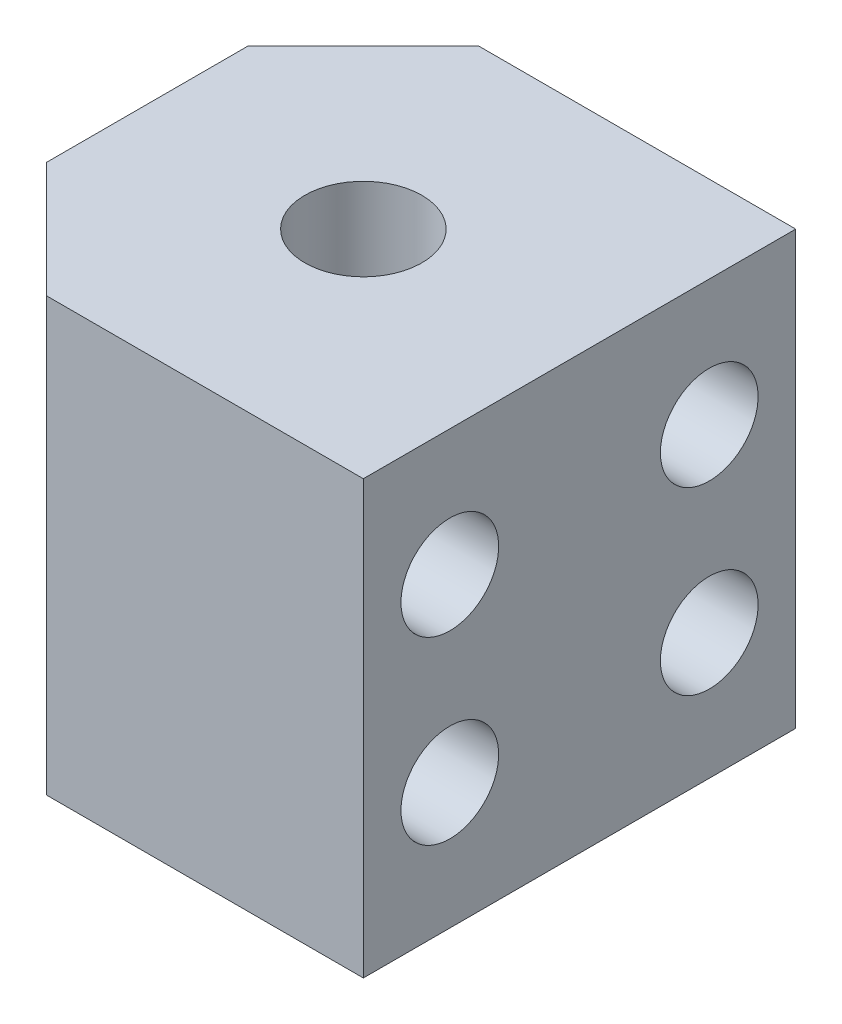
ISO-10303-21;
HEADER;
FILE_DESCRIPTION(('STEP AP214'),'2;1');
FILE_NAME('part.step','',(''),(''),'','','');
FILE_SCHEMA(('AUTOMOTIVE_DESIGN { 1 0 10303 214 1 1 1 1 }'));
ENDSEC;
DATA;
#1=APPLICATION_CONTEXT('core data for automotive mechanical design processes');
#2=APPLICATION_PROTOCOL_DEFINITION('international standard','automotive_design',2000,#1);
#3=PRODUCT_CONTEXT('',#1,'mechanical');
#4=PRODUCT('Part','Part','',(#3));
#5=PRODUCT_RELATED_PRODUCT_CATEGORY('part','',(#4));
#6=PRODUCT_DEFINITION_FORMATION('','',#4);
#7=PRODUCT_DEFINITION_CONTEXT('part definition',#1,'design');
#8=PRODUCT_DEFINITION('design','',#6,#7);
#9=PRODUCT_DEFINITION_SHAPE('','',#8);
#10=(LENGTH_UNIT() NAMED_UNIT(*) SI_UNIT(.MILLI.,.METRE.));
#11=(NAMED_UNIT(*) PLANE_ANGLE_UNIT() SI_UNIT($,.RADIAN.));
#12=(NAMED_UNIT(*) SI_UNIT($,.STERADIAN.) SOLID_ANGLE_UNIT());
#13=UNCERTAINTY_MEASURE_WITH_UNIT(LENGTH_MEASURE(1.E-05),#10,'distance_accuracy_value','');
#14=(GEOMETRIC_REPRESENTATION_CONTEXT(3) GLOBAL_UNCERTAINTY_ASSIGNED_CONTEXT((#13)) GLOBAL_UNIT_ASSIGNED_CONTEXT((#10,
#11,#12)) REPRESENTATION_CONTEXT('',''));
#15=CARTESIAN_POINT('',(0.,0.,0.));
#16=DIRECTION('',(0.,0.,1.));
#17=DIRECTION('',(1.,0.,0.));
#18=AXIS2_PLACEMENT_3D('',#15,#16,#17);
#19=CARTESIAN_POINT('',(-9.525,19.05,-9.525));
#20=DIRECTION('',(1.,0.,0.));
#21=DIRECTION('',(0.,0.,-1.));
#22=AXIS2_PLACEMENT_3D('',#19,#20,#21);
#23=PLANE('',#22);
#24=DIRECTION('',(0.,0.,1.));
#25=VECTOR('',#24,1.);
#26=CARTESIAN_POINT('',(-9.525,19.05,-9.525));
#27=LINE('',#26,#25);
#28=CARTESIAN_POINT('',(-9.525,19.05,-4.445));
#29=VERTEX_POINT('',#28);
#30=CARTESIAN_POINT('',(-9.525,19.05,4.44499999999998));
#31=VERTEX_POINT('',#30);
#32=EDGE_CURVE('E124',#29,#31,#27,.T.);
#33=ORIENTED_EDGE('',*,*,#32,.F.);
#34=DIRECTION('',(0.,-1.,0.));
#35=VECTOR('',#34,1.);
#36=CARTESIAN_POINT('',(-9.525,19.05,-4.445));
#37=LINE('',#36,#35);
#38=CARTESIAN_POINT('',(-9.525,16.8016307248751,-4.445));
#39=VERTEX_POINT('',#38);
#40=EDGE_CURVE('E162',#29,#39,#37,.T.);
#41=ORIENTED_EDGE('',*,*,#40,.T.);
#42=CARTESIAN_POINT('',(-9.525,13.49375,-5.715));
#43=DIRECTION('',(-1.,0.,0.));
#44=DIRECTION('',(0.,0.,1.));
#45=AXIS2_PLACEMENT_3D('',#42,#43,#44);
#46=CIRCLE('',#45,3.5433);
#47=CARTESIAN_POINT('',(-9.525,10.1858692751249,-4.445));
#48=VERTEX_POINT('',#47);
#49=EDGE_CURVE('E214',#48,#39,#46,.T.);
#50=ORIENTED_EDGE('',*,*,#49,.F.);
#51=DIRECTION('',(0.,-1.,0.));
#52=VECTOR('',#51,1.);
#53=CARTESIAN_POINT('',(-9.525,19.05,-4.445));
#54=LINE('',#53,#52);
#55=CARTESIAN_POINT('',(-9.525,8.86413072487507,-4.445));
#56=VERTEX_POINT('',#55);
#57=EDGE_CURVE('E160',#48,#56,#54,.T.);
#58=ORIENTED_EDGE('',*,*,#57,.T.);
#59=CARTESIAN_POINT('',(-9.525,5.55625,-5.715));
#60=DIRECTION('',(-1.,0.,0.));
#61=DIRECTION('',(0.,0.,1.));
#62=AXIS2_PLACEMENT_3D('',#59,#60,#61);
#63=CIRCLE('',#62,3.5433);
#64=CARTESIAN_POINT('',(-9.525,2.24836927512493,-4.445));
#65=VERTEX_POINT('',#64);
#66=EDGE_CURVE('E226',#65,#56,#63,.T.);
#67=ORIENTED_EDGE('',*,*,#66,.F.);
#68=DIRECTION('',(0.,-1.,0.));
#69=VECTOR('',#68,1.);
#70=CARTESIAN_POINT('',(-9.525,19.05,-4.445));
#71=LINE('',#70,#69);
#72=CARTESIAN_POINT('',(-9.525,0.,-4.445));
#73=VERTEX_POINT('',#72);
#74=EDGE_CURVE('E158',#65,#73,#71,.T.);
#75=ORIENTED_EDGE('',*,*,#74,.T.);
#76=DIRECTION('',(0.,0.,1.));
#77=VECTOR('',#76,1.);
#78=CARTESIAN_POINT('',(-9.525,0.,-9.525));
#79=LINE('',#78,#77);
#80=CARTESIAN_POINT('',(-9.525,0.,4.44499999999998));
#81=VERTEX_POINT('',#80);
#82=EDGE_CURVE('E143',#73,#81,#79,.T.);
#83=ORIENTED_EDGE('',*,*,#82,.T.);
#84=DIRECTION('',(0.,1.,0.));
#85=VECTOR('',#84,1.);
#86=CARTESIAN_POINT('',(-9.525,19.05,4.44499999999999));
#87=LINE('',#86,#85);
#88=CARTESIAN_POINT('',(-9.525,2.24836927512494,4.44499999999999));
#89=VERTEX_POINT('',#88);
#90=EDGE_CURVE('E156',#81,#89,#87,.T.);
#91=ORIENTED_EDGE('',*,*,#90,.T.);
#92=CARTESIAN_POINT('',(-9.525,5.55625,5.715));
#93=DIRECTION('',(-1.,0.,0.));
#94=DIRECTION('',(0.,0.,1.));
#95=AXIS2_PLACEMENT_3D('',#92,#93,#94);
#96=CIRCLE('',#95,3.5433);
#97=CARTESIAN_POINT('',(-9.525,8.86413072487506,4.44499999999999));
#98=VERTEX_POINT('',#97);
#99=EDGE_CURVE('E183',#98,#89,#96,.T.);
#100=ORIENTED_EDGE('',*,*,#99,.F.);
#101=DIRECTION('',(0.,1.,0.));
#102=VECTOR('',#101,1.);
#103=CARTESIAN_POINT('',(-9.525,19.05,4.44499999999999));
#104=LINE('',#103,#102);
#105=CARTESIAN_POINT('',(-9.525,10.1858692751249,4.44499999999999));
#106=VERTEX_POINT('',#105);
#107=EDGE_CURVE('E154',#98,#106,#104,.T.);
#108=ORIENTED_EDGE('',*,*,#107,.T.);
#109=CARTESIAN_POINT('',(-9.525,13.49375,5.715));
#110=DIRECTION('',(-1.,0.,0.));
#111=DIRECTION('',(0.,0.,1.));
#112=AXIS2_PLACEMENT_3D('',#109,#110,#111);
#113=CIRCLE('',#112,3.5433);
#114=CARTESIAN_POINT('',(-9.525,16.8016307248751,4.44499999999999));
#115=VERTEX_POINT('',#114);
#116=EDGE_CURVE('E197',#115,#106,#113,.T.);
#117=ORIENTED_EDGE('',*,*,#116,.F.);
#118=DIRECTION('',(0.,1.,0.));
#119=VECTOR('',#118,1.);
#120=CARTESIAN_POINT('',(-9.525,19.05,4.44499999999999));
#121=LINE('',#120,#119);
#122=EDGE_CURVE('E133',#115,#31,#121,.T.);
#123=ORIENTED_EDGE('',*,*,#122,.T.);
#124=EDGE_LOOP('',(#33,#41,#50,#58,#67,#75,#83,#91,#100,#108,#117,#123));
#125=FACE_BOUND('',#124,.T.);
#126=ADVANCED_FACE('F39',(#125),#23,.F.);
#127=CARTESIAN_POINT('',(-9.525,19.05,9.525));
#128=DIRECTION('',(0.,0.,-1.));
#129=DIRECTION('',(-1.,0.,0.));
#130=AXIS2_PLACEMENT_3D('',#127,#128,#129);
#131=PLANE('',#130);
#132=DIRECTION('',(1.,0.,0.));
#133=VECTOR('',#132,1.);
#134=CARTESIAN_POINT('',(-9.525,19.05,9.525));
#135=LINE('',#134,#133);
#136=CARTESIAN_POINT('',(-4.445,19.05,9.525));
#137=VERTEX_POINT('',#136);
#138=CARTESIAN_POINT('',(9.525,19.05,9.525));
#139=VERTEX_POINT('',#138);
#140=EDGE_CURVE('E115',#137,#139,#135,.T.);
#141=ORIENTED_EDGE('',*,*,#140,.F.);
#142=DIRECTION('',(0.,-1.,0.));
#143=VECTOR('',#142,1.);
#144=CARTESIAN_POINT('',(-4.445,19.05,9.525));
#145=LINE('',#144,#143);
#146=CARTESIAN_POINT('',(-4.445,0.,9.525));
#147=VERTEX_POINT('',#146);
#148=EDGE_CURVE('E177',#137,#147,#145,.T.);
#149=ORIENTED_EDGE('',*,*,#148,.T.);
#150=DIRECTION('',(1.,0.,0.));
#151=VECTOR('',#150,1.);
#152=CARTESIAN_POINT('',(-9.525,0.,9.525));
#153=LINE('',#152,#151);
#154=CARTESIAN_POINT('',(9.525,0.,9.525));
#155=VERTEX_POINT('',#154);
#156=EDGE_CURVE('E130',#147,#155,#153,.T.);
#157=ORIENTED_EDGE('',*,*,#156,.T.);
#158=DIRECTION('',(0.,-1.,0.));
#159=VECTOR('',#158,1.);
#160=CARTESIAN_POINT('',(9.525,19.05,9.525));
#161=LINE('',#160,#159);
#162=EDGE_CURVE('E127',#139,#155,#161,.T.);
#163=ORIENTED_EDGE('',*,*,#162,.F.);
#164=EDGE_LOOP('',(#141,#149,#157,#163));
#165=FACE_BOUND('',#164,.T.);
#166=ADVANCED_FACE('F128',(#165),#131,.F.);
#167=CARTESIAN_POINT('',(9.525,19.05,-9.525));
#168=DIRECTION('',(-1.,0.,0.));
#169=DIRECTION('',(0.,0.,1.));
#170=AXIS2_PLACEMENT_3D('',#167,#168,#169);
#171=PLANE('',#170);
#172=CARTESIAN_POINT('',(9.525,5.55625,5.715));
#173=DIRECTION('',(-1.,0.,0.));
#174=DIRECTION('',(0.,0.,1.));
#175=AXIS2_PLACEMENT_3D('',#172,#173,#174);
#176=CIRCLE('',#175,2.15265);
#177=CARTESIAN_POINT('',(9.525,5.55625,7.86764999999999));
#178=VERTEX_POINT('',#177);
#179=EDGE_CURVE('E199',#178,#178,#176,.T.);
#180=ORIENTED_EDGE('',*,*,#179,.T.);
#181=EDGE_LOOP('',(#180));
#182=FACE_BOUND('',#181,.T.);
#183=CARTESIAN_POINT('',(9.525,13.49375,5.715));
#184=DIRECTION('',(-1.,0.,0.));
#185=DIRECTION('',(0.,0.,1.));
#186=AXIS2_PLACEMENT_3D('',#183,#184,#185);
#187=CIRCLE('',#186,2.15265);
#188=CARTESIAN_POINT('',(9.525,13.49375,7.86765));
#189=VERTEX_POINT('',#188);
#190=EDGE_CURVE('E211',#189,#189,#187,.T.);
#191=ORIENTED_EDGE('',*,*,#190,.T.);
#192=EDGE_LOOP('',(#191));
#193=FACE_BOUND('',#192,.T.);
#194=CARTESIAN_POINT('',(9.525,13.49375,-5.715));
#195=DIRECTION('',(-1.,0.,0.));
#196=DIRECTION('',(0.,0.,1.));
#197=AXIS2_PLACEMENT_3D('',#194,#195,#196);
#198=CIRCLE('',#197,2.15265);
#199=CARTESIAN_POINT('',(9.525,13.49375,-3.56235));
#200=VERTEX_POINT('',#199);
#201=EDGE_CURVE('E223',#200,#200,#198,.T.);
#202=ORIENTED_EDGE('',*,*,#201,.T.);
#203=EDGE_LOOP('',(#202));
#204=FACE_BOUND('',#203,.T.);
#205=CARTESIAN_POINT('',(9.525,5.55625,-5.715));
#206=DIRECTION('',(-1.,0.,0.));
#207=DIRECTION('',(0.,0.,1.));
#208=AXIS2_PLACEMENT_3D('',#205,#206,#207);
#209=CIRCLE('',#208,2.15265);
#210=CARTESIAN_POINT('',(9.525,5.55625,-3.56235));
#211=VERTEX_POINT('',#210);
#212=EDGE_CURVE('E235',#211,#211,#209,.T.);
#213=ORIENTED_EDGE('',*,*,#212,.T.);
#214=EDGE_LOOP('',(#213));
#215=FACE_BOUND('',#214,.T.);
#216=DIRECTION('',(0.,0.,-1.));
#217=VECTOR('',#216,1.);
#218=CARTESIAN_POINT('',(9.525,0.,-9.525));
#219=LINE('',#218,#217);
#220=CARTESIAN_POINT('',(9.525,0.,-9.525));
#221=VERTEX_POINT('',#220);
#222=EDGE_CURVE('E148',#155,#221,#219,.T.);
#223=ORIENTED_EDGE('',*,*,#222,.T.);
#224=DIRECTION('',(0.,-1.,0.));
#225=VECTOR('',#224,1.);
#226=CARTESIAN_POINT('',(9.525,19.05,-9.525));
#227=LINE('',#226,#225);
#228=CARTESIAN_POINT('',(9.525,19.05,-9.525));
#229=VERTEX_POINT('',#228);
#230=EDGE_CURVE('E134',#229,#221,#227,.T.);
#231=ORIENTED_EDGE('',*,*,#230,.F.);
#232=DIRECTION('',(0.,0.,-1.));
#233=VECTOR('',#232,1.);
#234=CARTESIAN_POINT('',(9.525,19.05,-9.525));
#235=LINE('',#234,#233);
#236=EDGE_CURVE('E119',#139,#229,#235,.T.);
#237=ORIENTED_EDGE('',*,*,#236,.F.);
#238=ORIENTED_EDGE('',*,*,#162,.T.);
#239=EDGE_LOOP('',(#223,#231,#237,#238));
#240=FACE_BOUND('',#239,.T.);
#241=ADVANCED_FACE('F136',(#182,#193,#204,#215,#240),#171,.F.);
#242=CARTESIAN_POINT('',(-9.525,19.05,-9.525));
#243=DIRECTION('',(0.,0.,1.));
#244=DIRECTION('',(1.,0.,0.));
#245=AXIS2_PLACEMENT_3D('',#242,#243,#244);
#246=PLANE('',#245);
#247=DIRECTION('',(-1.,0.,0.));
#248=VECTOR('',#247,1.);
#249=CARTESIAN_POINT('',(-9.525,0.,-9.525));
#250=LINE('',#249,#248);
#251=CARTESIAN_POINT('',(-4.44499999999999,0.,-9.525));
#252=VERTEX_POINT('',#251);
#253=EDGE_CURVE('E150',#221,#252,#250,.T.);
#254=ORIENTED_EDGE('',*,*,#253,.T.);
#255=DIRECTION('',(0.,1.,0.));
#256=VECTOR('',#255,1.);
#257=CARTESIAN_POINT('',(-4.44499999999999,19.05,-9.525));
#258=LINE('',#257,#256);
#259=CARTESIAN_POINT('',(-4.44499999999999,19.05,-9.525));
#260=VERTEX_POINT('',#259);
#261=EDGE_CURVE('E62',#252,#260,#258,.T.);
#262=ORIENTED_EDGE('',*,*,#261,.T.);
#263=DIRECTION('',(-1.,0.,0.));
#264=VECTOR('',#263,1.);
#265=CARTESIAN_POINT('',(-9.525,19.05,-9.525));
#266=LINE('',#265,#264);
#267=EDGE_CURVE('E138',#229,#260,#266,.T.);
#268=ORIENTED_EDGE('',*,*,#267,.F.);
#269=ORIENTED_EDGE('',*,*,#230,.T.);
#270=EDGE_LOOP('',(#254,#262,#268,#269));
#271=FACE_BOUND('',#270,.T.);
#272=ADVANCED_FACE('F248',(#271),#246,.F.);
#273=CARTESIAN_POINT('',(0.,19.05,0.));
#274=DIRECTION('',(0.,1.,0.));
#275=DIRECTION('',(0.,0.,1.));
#276=AXIS2_PLACEMENT_3D('',#273,#274,#275);
#277=PLANE('',#276);
#278=CARTESIAN_POINT('',(0.,19.05,0.));
#279=DIRECTION('',(0.,-1.,0.));
#280=DIRECTION('',(0.,0.,-1.));
#281=AXIS2_PLACEMENT_3D('',#278,#279,#280);
#282=CIRCLE('',#281,2.57937);
#283=CARTESIAN_POINT('',(0.,19.05,-2.57937));
#284=VERTEX_POINT('',#283);
#285=EDGE_CURVE('E146',#284,#284,#282,.T.);
#286=ORIENTED_EDGE('',*,*,#285,.T.);
#287=EDGE_LOOP('',(#286));
#288=FACE_BOUND('',#287,.T.);
#289=ORIENTED_EDGE('',*,*,#267,.T.);
#290=DIRECTION('',(0.707106781186549,0.,-0.707106781186547));
#291=VECTOR('',#290,1.);
#292=CARTESIAN_POINT('',(-6.98499999999999,19.05,-6.98500000000001));
#293=LINE('',#292,#291);
#294=EDGE_CURVE('E175',#260,#29,#293,.F.);
#295=ORIENTED_EDGE('',*,*,#294,.T.);
#296=ORIENTED_EDGE('',*,*,#32,.T.);
#297=DIRECTION('',(-0.707106781186547,0.,-0.707106781186548));
#298=VECTOR('',#297,1.);
#299=CARTESIAN_POINT('',(-6.985,19.05,6.98499999999999));
#300=LINE('',#299,#298);
#301=EDGE_CURVE('E54',#31,#137,#300,.F.);
#302=ORIENTED_EDGE('',*,*,#301,.T.);
#303=ORIENTED_EDGE('',*,*,#140,.T.);
#304=ORIENTED_EDGE('',*,*,#236,.T.);
#305=EDGE_LOOP('',(#289,#295,#296,#302,#303,#304));
#306=FACE_BOUND('',#305,.T.);
#307=ADVANCED_FACE('F117',(#288,#306),#277,.T.);
#308=CARTESIAN_POINT('',(0.,0.,0.));
#309=DIRECTION('',(0.,1.,0.));
#310=DIRECTION('',(0.,0.,1.));
#311=AXIS2_PLACEMENT_3D('',#308,#309,#310);
#312=PLANE('',#311);
#313=CARTESIAN_POINT('',(0.,0.,0.));
#314=DIRECTION('',(0.,-1.,0.));
#315=DIRECTION('',(0.,0.,-1.));
#316=AXIS2_PLACEMENT_3D('',#313,#314,#315);
#317=CIRCLE('',#316,2.57936999999999);
#318=CARTESIAN_POINT('',(0.,0.,-2.57936999999999));
#319=VERTEX_POINT('',#318);
#320=EDGE_CURVE('E238',#319,#319,#317,.T.);
#321=ORIENTED_EDGE('',*,*,#320,.F.);
#322=EDGE_LOOP('',(#321));
#323=FACE_BOUND('',#322,.T.);
#324=ORIENTED_EDGE('',*,*,#82,.F.);
#325=DIRECTION('',(-0.707106781186549,0.,0.707106781186547));
#326=VECTOR('',#325,1.);
#327=CARTESIAN_POINT('',(-9.525,0.,-4.445));
#328=LINE('',#327,#326);
#329=EDGE_CURVE('E171',#73,#252,#328,.F.);
#330=ORIENTED_EDGE('',*,*,#329,.T.);
#331=ORIENTED_EDGE('',*,*,#253,.F.);
#332=ORIENTED_EDGE('',*,*,#222,.F.);
#333=ORIENTED_EDGE('',*,*,#156,.F.);
#334=DIRECTION('',(0.707106781186547,0.,0.707106781186548));
#335=VECTOR('',#334,1.);
#336=CARTESIAN_POINT('',(-4.445,0.,9.525));
#337=LINE('',#336,#335);
#338=EDGE_CURVE('E169',#147,#81,#337,.F.);
#339=ORIENTED_EDGE('',*,*,#338,.T.);
#340=EDGE_LOOP('',(#324,#330,#331,#332,#333,#339));
#341=FACE_BOUND('',#340,.T.);
#342=ADVANCED_FACE('F246',(#323,#341),#312,.F.);
#343=CARTESIAN_POINT('',(0.,0.,0.));
#344=DIRECTION('',(0.,-1.,0.));
#345=DIRECTION('',(0.,0.,-1.));
#346=AXIS2_PLACEMENT_3D('',#343,#344,#345);
#347=CYLINDRICAL_SURFACE('',#346,2.57936999999999);
#348=ORIENTED_EDGE('',*,*,#285,.F.);
#349=EDGE_LOOP('',(#348));
#350=FACE_BOUND('',#349,.T.);
#351=ORIENTED_EDGE('',*,*,#320,.T.);
#352=EDGE_LOOP('',(#351));
#353=FACE_BOUND('',#352,.T.);
#354=ADVANCED_FACE('F362',(#350,#353),#347,.F.);
#355=CARTESIAN_POINT('',(-9.525,5.55625,-5.715));
#356=DIRECTION('',(-1.,0.,0.));
#357=DIRECTION('',(0.,0.,1.));
#358=AXIS2_PLACEMENT_3D('',#355,#356,#357);
#359=CYLINDRICAL_SURFACE('',#358,2.15265);
#360=ORIENTED_EDGE('',*,*,#212,.F.);
#361=EDGE_LOOP('',(#360));
#362=FACE_BOUND('',#361,.T.);
#363=CARTESIAN_POINT('',(-2.8452401744981,5.55625,-5.715));
#364=DIRECTION('',(-1.,0.,0.));
#365=DIRECTION('',(0.,0.,1.));
#366=AXIS2_PLACEMENT_3D('',#363,#364,#365);
#367=CIRCLE('',#366,2.15265);
#368=CARTESIAN_POINT('',(-2.8452401744981,5.55625,-3.56235));
#369=VERTEX_POINT('',#368);
#370=EDGE_CURVE('E232',#369,#369,#367,.T.);
#371=ORIENTED_EDGE('',*,*,#370,.T.);
#372=EDGE_LOOP('',(#371));
#373=FACE_BOUND('',#372,.T.);
#374=ADVANCED_FACE('F414',(#362,#373),#359,.F.);
#375=CARTESIAN_POINT('',(-4.445,5.55625,-5.715));
#376=DIRECTION('',(-1.,0.,0.));
#377=DIRECTION('',(0.,0.,1.));
#378=AXIS2_PLACEMENT_3D('',#375,#376,#377);
#379=CONICAL_SURFACE('',#378,3.5433,0.715584993317675);
#380=ORIENTED_EDGE('',*,*,#370,.F.);
#381=EDGE_LOOP('',(#380));
#382=FACE_BOUND('',#381,.T.);
#383=CARTESIAN_POINT('',(-4.445,5.55625,-5.715));
#384=DIRECTION('',(-1.,0.,0.));
#385=DIRECTION('',(0.,0.,1.));
#386=AXIS2_PLACEMENT_3D('',#383,#384,#385);
#387=CIRCLE('',#386,3.5433);
#388=CARTESIAN_POINT('',(-4.445,5.55625,-2.1717));
#389=VERTEX_POINT('',#388);
#390=EDGE_CURVE('E229',#389,#389,#387,.T.);
#391=ORIENTED_EDGE('',*,*,#390,.T.);
#392=EDGE_LOOP('',(#391));
#393=FACE_BOUND('',#392,.T.);
#394=ADVANCED_FACE('F374',(#382,#393),#379,.F.);
#395=CARTESIAN_POINT('',(-9.525,5.55625,-5.715));
#396=DIRECTION('',(-1.,0.,0.));
#397=DIRECTION('',(0.,0.,1.));
#398=AXIS2_PLACEMENT_3D('',#395,#396,#397);
#399=CYLINDRICAL_SURFACE('',#398,3.5433);
#400=ORIENTED_EDGE('',*,*,#390,.F.);
#401=EDGE_LOOP('',(#400));
#402=FACE_BOUND('',#401,.T.);
#403=ORIENTED_EDGE('',*,*,#66,.T.);
#404=CARTESIAN_POINT('',(-8.255,5.55625,-5.715));
#405=DIRECTION('',(0.707106781186547,0.,0.707106781186549));
#406=DIRECTION('',(-0.707106781186549,0.,0.707106781186547));
#407=AXIS2_PLACEMENT_3D('',#404,#405,#406);
#408=ELLIPSE('',#407,5.0109829155566,3.5433);
#409=EDGE_CURVE('E167',#56,#65,#408,.F.);
#410=ORIENTED_EDGE('',*,*,#409,.T.);
#411=EDGE_LOOP('',(#403,#410));
#412=FACE_BOUND('',#411,.T.);
#413=ADVANCED_FACE('F370',(#402,#412),#399,.F.);
#414=CARTESIAN_POINT('',(-9.525,13.49375,-5.715));
#415=DIRECTION('',(-1.,0.,0.));
#416=DIRECTION('',(0.,0.,1.));
#417=AXIS2_PLACEMENT_3D('',#414,#415,#416);
#418=CYLINDRICAL_SURFACE('',#417,2.15265);
#419=ORIENTED_EDGE('',*,*,#201,.F.);
#420=EDGE_LOOP('',(#419));
#421=FACE_BOUND('',#420,.T.);
#422=CARTESIAN_POINT('',(-2.8452401744981,13.49375,-5.715));
#423=DIRECTION('',(-1.,0.,0.));
#424=DIRECTION('',(0.,0.,1.));
#425=AXIS2_PLACEMENT_3D('',#422,#423,#424);
#426=CIRCLE('',#425,2.15265);
#427=CARTESIAN_POINT('',(-2.8452401744981,13.49375,-3.56235));
#428=VERTEX_POINT('',#427);
#429=EDGE_CURVE('E220',#428,#428,#426,.T.);
#430=ORIENTED_EDGE('',*,*,#429,.T.);
#431=EDGE_LOOP('',(#430));
#432=FACE_BOUND('',#431,.T.);
#433=ADVANCED_FACE('F268',(#421,#432),#418,.F.);
#434=CARTESIAN_POINT('',(-4.445,13.49375,-5.715));
#435=DIRECTION('',(-1.,0.,0.));
#436=DIRECTION('',(0.,0.,1.));
#437=AXIS2_PLACEMENT_3D('',#434,#435,#436);
#438=CONICAL_SURFACE('',#437,3.5433,0.715584993317674);
#439=ORIENTED_EDGE('',*,*,#429,.F.);
#440=EDGE_LOOP('',(#439));
#441=FACE_BOUND('',#440,.T.);
#442=CARTESIAN_POINT('',(-4.445,13.49375,-5.715));
#443=DIRECTION('',(-1.,0.,0.));
#444=DIRECTION('',(0.,0.,1.));
#445=AXIS2_PLACEMENT_3D('',#442,#443,#444);
#446=CIRCLE('',#445,3.5433);
#447=CARTESIAN_POINT('',(-4.445,13.49375,-2.1717));
#448=VERTEX_POINT('',#447);
#449=EDGE_CURVE('E217',#448,#448,#446,.T.);
#450=ORIENTED_EDGE('',*,*,#449,.T.);
#451=EDGE_LOOP('',(#450));
#452=FACE_BOUND('',#451,.T.);
#453=ADVANCED_FACE('F258',(#441,#452),#438,.F.);
#454=CARTESIAN_POINT('',(-9.525,13.49375,-5.715));
#455=DIRECTION('',(-1.,0.,0.));
#456=DIRECTION('',(0.,0.,1.));
#457=AXIS2_PLACEMENT_3D('',#454,#455,#456);
#458=CYLINDRICAL_SURFACE('',#457,3.5433);
#459=ORIENTED_EDGE('',*,*,#449,.F.);
#460=EDGE_LOOP('',(#459));
#461=FACE_BOUND('',#460,.T.);
#462=ORIENTED_EDGE('',*,*,#49,.T.);
#463=CARTESIAN_POINT('',(-8.255,13.49375,-5.715));
#464=DIRECTION('',(0.707106781186547,0.,0.707106781186549));
#465=DIRECTION('',(-0.707106781186549,0.,0.707106781186547));
#466=AXIS2_PLACEMENT_3D('',#463,#464,#465);
#467=ELLIPSE('',#466,5.01098291555659,3.5433);
#468=EDGE_CURVE('E165',#39,#48,#467,.F.);
#469=ORIENTED_EDGE('',*,*,#468,.T.);
#470=EDGE_LOOP('',(#462,#469));
#471=FACE_BOUND('',#470,.T.);
#472=ADVANCED_FACE('F255',(#461,#471),#458,.F.);
#473=CARTESIAN_POINT('',(-9.525,13.49375,5.715));
#474=DIRECTION('',(-1.,0.,0.));
#475=DIRECTION('',(0.,0.,1.));
#476=AXIS2_PLACEMENT_3D('',#473,#474,#475);
#477=CYLINDRICAL_SURFACE('',#476,2.15265);
#478=ORIENTED_EDGE('',*,*,#190,.F.);
#479=EDGE_LOOP('',(#478));
#480=FACE_BOUND('',#479,.T.);
#481=CARTESIAN_POINT('',(-2.8452401744981,13.49375,5.715));
#482=DIRECTION('',(-1.,0.,0.));
#483=DIRECTION('',(0.,0.,1.));
#484=AXIS2_PLACEMENT_3D('',#481,#482,#483);
#485=CIRCLE('',#484,2.15265);
#486=CARTESIAN_POINT('',(-2.8452401744981,13.49375,7.86765));
#487=VERTEX_POINT('',#486);
#488=EDGE_CURVE('E202',#487,#487,#485,.T.);
#489=ORIENTED_EDGE('',*,*,#488,.T.);
#490=EDGE_LOOP('',(#489));
#491=FACE_BOUND('',#490,.T.);
#492=ADVANCED_FACE('F257',(#480,#491),#477,.F.);
#493=CARTESIAN_POINT('',(-4.445,13.49375,5.715));
#494=DIRECTION('',(-1.,0.,0.));
#495=DIRECTION('',(0.,0.,1.));
#496=AXIS2_PLACEMENT_3D('',#493,#494,#495);
#497=CONICAL_SURFACE('',#496,3.5433,0.715584993317674);
#498=ORIENTED_EDGE('',*,*,#488,.F.);
#499=EDGE_LOOP('',(#498));
#500=FACE_BOUND('',#499,.T.);
#501=CARTESIAN_POINT('',(-4.445,13.49375,5.715));
#502=DIRECTION('',(-1.,0.,0.));
#503=DIRECTION('',(0.,0.,1.));
#504=AXIS2_PLACEMENT_3D('',#501,#502,#503);
#505=CIRCLE('',#504,3.5433);
#506=CARTESIAN_POINT('',(-4.445,13.49375,9.2583));
#507=VERTEX_POINT('',#506);
#508=EDGE_CURVE('E198',#507,#507,#505,.T.);
#509=ORIENTED_EDGE('',*,*,#508,.T.);
#510=EDGE_LOOP('',(#509));
#511=FACE_BOUND('',#510,.T.);
#512=ADVANCED_FACE('F265',(#500,#511),#497,.F.);
#513=CARTESIAN_POINT('',(-9.525,13.49375,5.715));
#514=DIRECTION('',(-1.,0.,0.));
#515=DIRECTION('',(0.,0.,1.));
#516=AXIS2_PLACEMENT_3D('',#513,#514,#515);
#517=CYLINDRICAL_SURFACE('',#516,3.5433);
#518=ORIENTED_EDGE('',*,*,#508,.F.);
#519=EDGE_LOOP('',(#518));
#520=FACE_BOUND('',#519,.T.);
#521=ORIENTED_EDGE('',*,*,#116,.T.);
#522=CARTESIAN_POINT('',(-8.25499999999999,13.49375,5.715));
#523=DIRECTION('',(0.707106781186548,0.,-0.707106781186547));
#524=DIRECTION('',(-0.707106781186547,0.,-0.707106781186548));
#525=AXIS2_PLACEMENT_3D('',#522,#523,#524);
#526=ELLIPSE('',#525,5.01098291555658,3.5433);
#527=EDGE_CURVE('E11',#106,#115,#526,.F.);
#528=ORIENTED_EDGE('',*,*,#527,.T.);
#529=EDGE_LOOP('',(#521,#528));
#530=FACE_BOUND('',#529,.T.);
#531=ADVANCED_FACE('F196',(#520,#530),#517,.F.);
#532=CARTESIAN_POINT('',(-9.525,5.55625,5.715));
#533=DIRECTION('',(-1.,0.,0.));
#534=DIRECTION('',(0.,0.,1.));
#535=AXIS2_PLACEMENT_3D('',#532,#533,#534);
#536=CYLINDRICAL_SURFACE('',#535,2.15265);
#537=ORIENTED_EDGE('',*,*,#179,.F.);
#538=EDGE_LOOP('',(#537));
#539=FACE_BOUND('',#538,.T.);
#540=CARTESIAN_POINT('',(-2.8452401744981,5.55625,5.715));
#541=DIRECTION('',(-1.,0.,0.));
#542=DIRECTION('',(0.,0.,1.));
#543=AXIS2_PLACEMENT_3D('',#540,#541,#542);
#544=CIRCLE('',#543,2.15265);
#545=CARTESIAN_POINT('',(-2.8452401744981,5.55625,7.86765));
#546=VERTEX_POINT('',#545);
#547=EDGE_CURVE('E205',#546,#546,#544,.T.);
#548=ORIENTED_EDGE('',*,*,#547,.T.);
#549=EDGE_LOOP('',(#548));
#550=FACE_BOUND('',#549,.T.);
#551=ADVANCED_FACE('F290',(#539,#550),#536,.F.);
#552=CARTESIAN_POINT('',(-4.445,5.55625,5.715));
#553=DIRECTION('',(-1.,0.,0.));
#554=DIRECTION('',(0.,0.,1.));
#555=AXIS2_PLACEMENT_3D('',#552,#553,#554);
#556=CONICAL_SURFACE('',#555,3.5433,0.715584993317675);
#557=ORIENTED_EDGE('',*,*,#547,.F.);
#558=EDGE_LOOP('',(#557));
#559=FACE_BOUND('',#558,.T.);
#560=CARTESIAN_POINT('',(-4.445,5.55625,5.715));
#561=DIRECTION('',(-1.,0.,0.));
#562=DIRECTION('',(0.,0.,1.));
#563=AXIS2_PLACEMENT_3D('',#560,#561,#562);
#564=CIRCLE('',#563,3.5433);
#565=CARTESIAN_POINT('',(-4.445,5.55625,9.2583));
#566=VERTEX_POINT('',#565);
#567=EDGE_CURVE('E191',#566,#566,#564,.T.);
#568=ORIENTED_EDGE('',*,*,#567,.T.);
#569=EDGE_LOOP('',(#568));
#570=FACE_BOUND('',#569,.T.);
#571=ADVANCED_FACE('F284',(#559,#570),#556,.F.);
#572=CARTESIAN_POINT('',(-9.525,5.55625,5.715));
#573=DIRECTION('',(-1.,0.,0.));
#574=DIRECTION('',(0.,0.,1.));
#575=AXIS2_PLACEMENT_3D('',#572,#573,#574);
#576=CYLINDRICAL_SURFACE('',#575,3.5433);
#577=ORIENTED_EDGE('',*,*,#567,.F.);
#578=EDGE_LOOP('',(#577));
#579=FACE_BOUND('',#578,.T.);
#580=ORIENTED_EDGE('',*,*,#99,.T.);
#581=CARTESIAN_POINT('',(-8.25499999999999,5.55625,5.715));
#582=DIRECTION('',(0.707106781186548,0.,-0.707106781186547));
#583=DIRECTION('',(-0.707106781186547,0.,-0.707106781186548));
#584=AXIS2_PLACEMENT_3D('',#581,#582,#583);
#585=ELLIPSE('',#584,5.01098291555658,3.5433);
#586=EDGE_CURVE('E47',#89,#98,#585,.F.);
#587=ORIENTED_EDGE('',*,*,#586,.T.);
#588=EDGE_LOOP('',(#580,#587));
#589=FACE_BOUND('',#588,.T.);
#590=ADVANCED_FACE('F182',(#579,#589),#576,.F.);
#591=CARTESIAN_POINT('',(-9.525,19.05,-4.445));
#592=DIRECTION('',(0.707106781186547,0.,0.707106781186549));
#593=DIRECTION('',(0.,-1.,0.));
#594=AXIS2_PLACEMENT_3D('',#591,#592,#593);
#595=PLANE('',#594);
#596=ORIENTED_EDGE('',*,*,#294,.F.);
#597=ORIENTED_EDGE('',*,*,#261,.F.);
#598=ORIENTED_EDGE('',*,*,#329,.F.);
#599=ORIENTED_EDGE('',*,*,#74,.F.);
#600=ORIENTED_EDGE('',*,*,#409,.F.);
#601=ORIENTED_EDGE('',*,*,#57,.F.);
#602=ORIENTED_EDGE('',*,*,#468,.F.);
#603=ORIENTED_EDGE('',*,*,#40,.F.);
#604=EDGE_LOOP('',(#596,#597,#598,#599,#600,#601,#602,#603));
#605=FACE_BOUND('',#604,.T.);
#606=ADVANCED_FACE('F250',(#605),#595,.F.);
#607=CARTESIAN_POINT('',(-4.445,19.05,9.525));
#608=DIRECTION('',(0.707106781186548,0.,-0.707106781186547));
#609=DIRECTION('',(0.,-1.,0.));
#610=AXIS2_PLACEMENT_3D('',#607,#608,#609);
#611=PLANE('',#610);
#612=ORIENTED_EDGE('',*,*,#586,.F.);
#613=ORIENTED_EDGE('',*,*,#90,.F.);
#614=ORIENTED_EDGE('',*,*,#338,.F.);
#615=ORIENTED_EDGE('',*,*,#148,.F.);
#616=ORIENTED_EDGE('',*,*,#301,.F.);
#617=ORIENTED_EDGE('',*,*,#122,.F.);
#618=ORIENTED_EDGE('',*,*,#527,.F.);
#619=ORIENTED_EDGE('',*,*,#107,.F.);
#620=EDGE_LOOP('',(#612,#613,#614,#615,#616,#617,#618,#619));
#621=FACE_BOUND('',#620,.T.);
#622=ADVANCED_FACE('F41',(#621),#611,.F.);
#623=CLOSED_SHELL('',(#126,#166,#241,#272,#307,#342,#354,#374,#394,#413,#433,#453,#472,#492,
#512,#531,#551,#571,#590,#606,#622));
#624=MANIFOLD_SOLID_BREP('B2',#623);
#625=ADVANCED_BREP_SHAPE_REPRESENTATION('',(#18,#624),#14);
#626=SHAPE_DEFINITION_REPRESENTATION(#9,#625);
ENDSEC;
END-ISO-10303-21;
